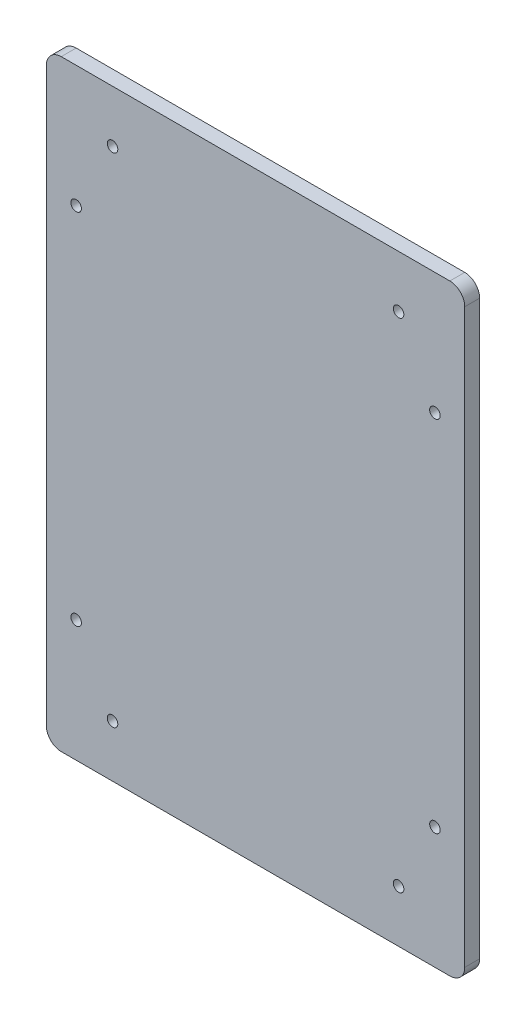
ISO-10303-21;
HEADER;
FILE_DESCRIPTION(('STEP AP214'),'2;1');
FILE_NAME('part.step','',(''),(''),'','','');
FILE_SCHEMA(('AUTOMOTIVE_DESIGN { 1 0 10303 214 1 1 1 1 }'));
ENDSEC;
DATA;
#1=APPLICATION_CONTEXT('core data for automotive mechanical design processes');
#2=APPLICATION_PROTOCOL_DEFINITION('international standard','automotive_design',2000,#1);
#3=PRODUCT_CONTEXT('',#1,'mechanical');
#4=PRODUCT('Part','Part','',(#3));
#5=PRODUCT_RELATED_PRODUCT_CATEGORY('part','',(#4));
#6=PRODUCT_DEFINITION_FORMATION('','',#4);
#7=PRODUCT_DEFINITION_CONTEXT('part definition',#1,'design');
#8=PRODUCT_DEFINITION('design','',#6,#7);
#9=PRODUCT_DEFINITION_SHAPE('','',#8);
#10=(LENGTH_UNIT() NAMED_UNIT(*) SI_UNIT(.MILLI.,.METRE.));
#11=(NAMED_UNIT(*) PLANE_ANGLE_UNIT() SI_UNIT($,.RADIAN.));
#12=(NAMED_UNIT(*) SI_UNIT($,.STERADIAN.) SOLID_ANGLE_UNIT());
#13=UNCERTAINTY_MEASURE_WITH_UNIT(LENGTH_MEASURE(1.E-05),#10,'distance_accuracy_value','');
#14=(GEOMETRIC_REPRESENTATION_CONTEXT(3) GLOBAL_UNCERTAINTY_ASSIGNED_CONTEXT((#13)) GLOBAL_UNIT_ASSIGNED_CONTEXT((#10,
#11,#12)) REPRESENTATION_CONTEXT('',''));
#15=CARTESIAN_POINT('',(0.,0.,0.));
#16=DIRECTION('',(0.,0.,1.));
#17=DIRECTION('',(1.,0.,0.));
#18=AXIS2_PLACEMENT_3D('',#15,#16,#17);
#19=CARTESIAN_POINT('',(89.16035,-128.27,6.35));
#20=DIRECTION('',(-1.,0.,0.));
#21=DIRECTION('',(0.,0.,1.));
#22=AXIS2_PLACEMENT_3D('',#19,#20,#21);
#23=PLANE('',#22);
#24=DIRECTION('',(0.,1.,0.));
#25=VECTOR('',#24,1.);
#26=CARTESIAN_POINT('',(89.16035,-128.27,0.));
#27=LINE('',#26,#25);
#28=CARTESIAN_POINT('',(89.16035,-121.92,0.));
#29=VERTEX_POINT('',#28);
#30=CARTESIAN_POINT('',(89.16035,121.92,0.));
#31=VERTEX_POINT('',#30);
#32=EDGE_CURVE('E126',#29,#31,#27,.T.);
#33=ORIENTED_EDGE('',*,*,#32,.T.);
#34=DIRECTION('',(0.,0.,-1.));
#35=VECTOR('',#34,1.);
#36=CARTESIAN_POINT('',(89.16035,121.92,6.35));
#37=LINE('',#36,#35);
#38=CARTESIAN_POINT('',(89.16035,121.92,6.35));
#39=VERTEX_POINT('',#38);
#40=EDGE_CURVE('E104',#31,#39,#37,.F.);
#41=ORIENTED_EDGE('',*,*,#40,.T.);
#42=DIRECTION('',(0.,1.,0.));
#43=VECTOR('',#42,1.);
#44=CARTESIAN_POINT('',(89.16035,-128.27,6.35));
#45=LINE('',#44,#43);
#46=CARTESIAN_POINT('',(89.16035,-121.92,6.35));
#47=VERTEX_POINT('',#46);
#48=EDGE_CURVE('E136',#47,#39,#45,.T.);
#49=ORIENTED_EDGE('',*,*,#48,.F.);
#50=DIRECTION('',(0.,0.,-1.));
#51=VECTOR('',#50,1.);
#52=CARTESIAN_POINT('',(89.16035,-121.92,6.35));
#53=LINE('',#52,#51);
#54=EDGE_CURVE('E109',#47,#29,#53,.T.);
#55=ORIENTED_EDGE('',*,*,#54,.T.);
#56=EDGE_LOOP('',(#33,#41,#49,#55));
#57=FACE_BOUND('',#56,.T.);
#58=ADVANCED_FACE('F33',(#57),#23,.F.);
#59=CARTESIAN_POINT('',(-89.16035,128.27,6.35));
#60=DIRECTION('',(0.,-1.,0.));
#61=DIRECTION('',(0.,0.,-1.));
#62=AXIS2_PLACEMENT_3D('',#59,#60,#61);
#63=PLANE('',#62);
#64=DIRECTION('',(-1.,0.,0.));
#65=VECTOR('',#64,1.);
#66=CARTESIAN_POINT('',(-89.16035,128.27,6.35));
#67=LINE('',#66,#65);
#68=CARTESIAN_POINT('',(82.8103499999999,128.27,6.35));
#69=VERTEX_POINT('',#68);
#70=CARTESIAN_POINT('',(-82.81035,128.27,6.35));
#71=VERTEX_POINT('',#70);
#72=EDGE_CURVE('E119',#69,#71,#67,.T.);
#73=ORIENTED_EDGE('',*,*,#72,.F.);
#74=DIRECTION('',(0.,0.,-1.));
#75=VECTOR('',#74,1.);
#76=CARTESIAN_POINT('',(82.81035,128.27,6.35));
#77=LINE('',#76,#75);
#78=CARTESIAN_POINT('',(82.8103499999999,128.27,0.));
#79=VERTEX_POINT('',#78);
#80=EDGE_CURVE('E103',#69,#79,#77,.T.);
#81=ORIENTED_EDGE('',*,*,#80,.T.);
#82=DIRECTION('',(-1.,0.,0.));
#83=VECTOR('',#82,1.);
#84=CARTESIAN_POINT('',(-89.16035,128.27,0.));
#85=LINE('',#84,#83);
#86=CARTESIAN_POINT('',(-82.81035,128.27,0.));
#87=VERTEX_POINT('',#86);
#88=EDGE_CURVE('E116',#79,#87,#85,.T.);
#89=ORIENTED_EDGE('',*,*,#88,.T.);
#90=DIRECTION('',(0.,0.,-1.));
#91=VECTOR('',#90,1.);
#92=CARTESIAN_POINT('',(-82.81035,128.27,6.35));
#93=LINE('',#92,#91);
#94=EDGE_CURVE('E121',#87,#71,#93,.F.);
#95=ORIENTED_EDGE('',*,*,#94,.T.);
#96=EDGE_LOOP('',(#73,#81,#89,#95));
#97=FACE_BOUND('',#96,.T.);
#98=ADVANCED_FACE('F115',(#97),#63,.F.);
#99=CARTESIAN_POINT('',(-89.16035,-128.27,6.35));
#100=DIRECTION('',(1.,0.,0.));
#101=DIRECTION('',(0.,0.,-1.));
#102=AXIS2_PLACEMENT_3D('',#99,#100,#101);
#103=PLANE('',#102);
#104=DIRECTION('',(0.,-1.,0.));
#105=VECTOR('',#104,1.);
#106=CARTESIAN_POINT('',(-89.16035,-128.27,0.));
#107=LINE('',#106,#105);
#108=CARTESIAN_POINT('',(-89.16035,121.92,0.));
#109=VERTEX_POINT('',#108);
#110=CARTESIAN_POINT('',(-89.16035,-121.92,0.));
#111=VERTEX_POINT('',#110);
#112=EDGE_CURVE('E125',#109,#111,#107,.T.);
#113=ORIENTED_EDGE('',*,*,#112,.T.);
#114=DIRECTION('',(0.,0.,-1.));
#115=VECTOR('',#114,1.);
#116=CARTESIAN_POINT('',(-89.16035,-121.92,6.35));
#117=LINE('',#116,#115);
#118=CARTESIAN_POINT('',(-89.16035,-121.92,6.35));
#119=VERTEX_POINT('',#118);
#120=EDGE_CURVE('E11',#111,#119,#117,.F.);
#121=ORIENTED_EDGE('',*,*,#120,.T.);
#122=DIRECTION('',(0.,-1.,0.));
#123=VECTOR('',#122,1.);
#124=CARTESIAN_POINT('',(-89.16035,-128.27,6.35));
#125=LINE('',#124,#123);
#126=CARTESIAN_POINT('',(-89.16035,121.92,6.35));
#127=VERTEX_POINT('',#126);
#128=EDGE_CURVE('E162',#127,#119,#125,.T.);
#129=ORIENTED_EDGE('',*,*,#128,.F.);
#130=DIRECTION('',(0.,0.,-1.));
#131=VECTOR('',#130,1.);
#132=CARTESIAN_POINT('',(-89.16035,121.92,6.35));
#133=LINE('',#132,#131);
#134=EDGE_CURVE('E41',#127,#109,#133,.T.);
#135=ORIENTED_EDGE('',*,*,#134,.T.);
#136=EDGE_LOOP('',(#113,#121,#129,#135));
#137=FACE_BOUND('',#136,.T.);
#138=ADVANCED_FACE('F160',(#137),#103,.F.);
#139=CARTESIAN_POINT('',(-89.16035,-128.27,6.35));
#140=DIRECTION('',(0.,1.,0.));
#141=DIRECTION('',(0.,0.,1.));
#142=AXIS2_PLACEMENT_3D('',#139,#140,#141);
#143=PLANE('',#142);
#144=DIRECTION('',(1.,0.,0.));
#145=VECTOR('',#144,1.);
#146=CARTESIAN_POINT('',(-89.16035,-128.27,0.));
#147=LINE('',#146,#145);
#148=CARTESIAN_POINT('',(-82.81035,-128.27,0.));
#149=VERTEX_POINT('',#148);
#150=CARTESIAN_POINT('',(82.8103499999999,-128.27,0.));
#151=VERTEX_POINT('',#150);
#152=EDGE_CURVE('E129',#149,#151,#147,.T.);
#153=ORIENTED_EDGE('',*,*,#152,.T.);
#154=DIRECTION('',(0.,0.,-1.));
#155=VECTOR('',#154,1.);
#156=CARTESIAN_POINT('',(82.81035,-128.27,6.35));
#157=LINE('',#156,#155);
#158=CARTESIAN_POINT('',(82.8103499999999,-128.27,6.35));
#159=VERTEX_POINT('',#158);
#160=EDGE_CURVE('E48',#151,#159,#157,.F.);
#161=ORIENTED_EDGE('',*,*,#160,.T.);
#162=DIRECTION('',(1.,0.,0.));
#163=VECTOR('',#162,1.);
#164=CARTESIAN_POINT('',(-89.16035,-128.27,6.35));
#165=LINE('',#164,#163);
#166=CARTESIAN_POINT('',(-82.81035,-128.27,6.35));
#167=VERTEX_POINT('',#166);
#168=EDGE_CURVE('E137',#167,#159,#165,.T.);
#169=ORIENTED_EDGE('',*,*,#168,.F.);
#170=DIRECTION('',(0.,0.,-1.));
#171=VECTOR('',#170,1.);
#172=CARTESIAN_POINT('',(-82.81035,-128.27,6.35));
#173=LINE('',#172,#171);
#174=EDGE_CURVE('E153',#167,#149,#173,.T.);
#175=ORIENTED_EDGE('',*,*,#174,.T.);
#176=EDGE_LOOP('',(#153,#161,#169,#175));
#177=FACE_BOUND('',#176,.T.);
#178=ADVANCED_FACE('F169',(#177),#143,.F.);
#179=CARTESIAN_POINT('',(0.,0.,6.35));
#180=DIRECTION('',(0.,0.,-1.));
#181=DIRECTION('',(-1.,0.,0.));
#182=AXIS2_PLACEMENT_3D('',#179,#180,#181);
#183=PLANE('',#182);
#184=CARTESIAN_POINT('',(60.96,106.045,6.34999999999999));
#185=DIRECTION('',(0.,0.,-1.));
#186=DIRECTION('',(-1.,0.,0.));
#187=AXIS2_PLACEMENT_3D('',#184,#185,#186);
#188=CIRCLE('',#187,2.24789999999999);
#189=CARTESIAN_POINT('',(58.7121,106.045,6.34999999999999));
#190=VERTEX_POINT('',#189);
#191=EDGE_CURVE('E217',#190,#190,#188,.T.);
#192=ORIENTED_EDGE('',*,*,#191,.T.);
#193=EDGE_LOOP('',(#192));
#194=FACE_BOUND('',#193,.T.);
#195=CARTESIAN_POINT('',(-60.96,106.045,6.34999999999999));
#196=DIRECTION('',(0.,0.,-1.));
#197=DIRECTION('',(-1.,0.,0.));
#198=AXIS2_PLACEMENT_3D('',#195,#196,#197);
#199=CIRCLE('',#198,2.24789999999999);
#200=CARTESIAN_POINT('',(-63.2079,106.045,6.34999999999999));
#201=VERTEX_POINT('',#200);
#202=EDGE_CURVE('E211',#201,#201,#199,.T.);
#203=ORIENTED_EDGE('',*,*,#202,.T.);
#204=EDGE_LOOP('',(#203));
#205=FACE_BOUND('',#204,.T.);
#206=CARTESIAN_POINT('',(60.96,-106.045,6.34999999999999));
#207=DIRECTION('',(0.,0.,-1.));
#208=DIRECTION('',(-1.,0.,0.));
#209=AXIS2_PLACEMENT_3D('',#206,#207,#208);
#210=CIRCLE('',#209,2.24789999999999);
#211=CARTESIAN_POINT('',(58.7121,-106.045,6.34999999999999));
#212=VERTEX_POINT('',#211);
#213=EDGE_CURVE('E205',#212,#212,#210,.T.);
#214=ORIENTED_EDGE('',*,*,#213,.T.);
#215=EDGE_LOOP('',(#214));
#216=FACE_BOUND('',#215,.T.);
#217=CARTESIAN_POINT('',(-60.96,-106.045,6.34999999999999));
#218=DIRECTION('',(0.,0.,-1.));
#219=DIRECTION('',(-1.,0.,0.));
#220=AXIS2_PLACEMENT_3D('',#217,#218,#219);
#221=CIRCLE('',#220,2.24789999999999);
#222=CARTESIAN_POINT('',(-63.2079,-106.045,6.34999999999999));
#223=VERTEX_POINT('',#222);
#224=EDGE_CURVE('E199',#223,#223,#221,.T.);
#225=ORIENTED_EDGE('',*,*,#224,.T.);
#226=EDGE_LOOP('',(#225));
#227=FACE_BOUND('',#226,.T.);
#228=CARTESIAN_POINT('',(76.46035,-76.46035,6.34999999999999));
#229=DIRECTION('',(0.,0.,-1.));
#230=DIRECTION('',(-1.,0.,0.));
#231=AXIS2_PLACEMENT_3D('',#228,#229,#230);
#232=CIRCLE('',#231,2.24789999999998);
#233=CARTESIAN_POINT('',(74.21245,-76.46035,6.34999999999999));
#234=VERTEX_POINT('',#233);
#235=EDGE_CURVE('E193',#234,#234,#232,.T.);
#236=ORIENTED_EDGE('',*,*,#235,.T.);
#237=EDGE_LOOP('',(#236));
#238=FACE_BOUND('',#237,.T.);
#239=CARTESIAN_POINT('',(76.46035,76.46035,6.34999999999999));
#240=DIRECTION('',(0.,0.,-1.));
#241=DIRECTION('',(-1.,0.,0.));
#242=AXIS2_PLACEMENT_3D('',#239,#240,#241);
#243=CIRCLE('',#242,2.24789999999998);
#244=CARTESIAN_POINT('',(74.21245,76.46035,6.34999999999999));
#245=VERTEX_POINT('',#244);
#246=EDGE_CURVE('E187',#245,#245,#243,.T.);
#247=ORIENTED_EDGE('',*,*,#246,.T.);
#248=EDGE_LOOP('',(#247));
#249=FACE_BOUND('',#248,.T.);
#250=CARTESIAN_POINT('',(-76.46035,76.46035,6.34999999999999));
#251=DIRECTION('',(0.,0.,-1.));
#252=DIRECTION('',(-1.,0.,0.));
#253=AXIS2_PLACEMENT_3D('',#250,#251,#252);
#254=CIRCLE('',#253,2.24789999999998);
#255=CARTESIAN_POINT('',(-78.7082499999999,76.46035,6.34999999999999));
#256=VERTEX_POINT('',#255);
#257=EDGE_CURVE('E181',#256,#256,#254,.T.);
#258=ORIENTED_EDGE('',*,*,#257,.T.);
#259=EDGE_LOOP('',(#258));
#260=FACE_BOUND('',#259,.T.);
#261=CARTESIAN_POINT('',(-76.46035,-76.46035,6.34999999999999));
#262=DIRECTION('',(0.,0.,-1.));
#263=DIRECTION('',(-1.,0.,0.));
#264=AXIS2_PLACEMENT_3D('',#261,#262,#263);
#265=CIRCLE('',#264,2.24789999999998);
#266=CARTESIAN_POINT('',(-78.7082499999999,-76.46035,6.34999999999999));
#267=VERTEX_POINT('',#266);
#268=EDGE_CURVE('E131',#267,#267,#265,.T.);
#269=ORIENTED_EDGE('',*,*,#268,.T.);
#270=EDGE_LOOP('',(#269));
#271=FACE_BOUND('',#270,.T.);
#272=ORIENTED_EDGE('',*,*,#48,.T.);
#273=CARTESIAN_POINT('',(82.81035,121.92,6.35));
#274=DIRECTION('',(0.,0.,-1.));
#275=DIRECTION('',(-1.,0.,0.));
#276=AXIS2_PLACEMENT_3D('',#273,#274,#275);
#277=CIRCLE('',#276,6.35);
#278=EDGE_CURVE('E151',#39,#69,#277,.F.);
#279=ORIENTED_EDGE('',*,*,#278,.T.);
#280=ORIENTED_EDGE('',*,*,#72,.T.);
#281=CARTESIAN_POINT('',(-82.81035,121.92,6.35));
#282=DIRECTION('',(0.,0.,-1.));
#283=DIRECTION('',(-1.,0.,0.));
#284=AXIS2_PLACEMENT_3D('',#281,#282,#283);
#285=CIRCLE('',#284,6.35);
#286=EDGE_CURVE('E146',#71,#127,#285,.F.);
#287=ORIENTED_EDGE('',*,*,#286,.T.);
#288=ORIENTED_EDGE('',*,*,#128,.T.);
#289=CARTESIAN_POINT('',(-82.81035,-121.92,6.35));
#290=DIRECTION('',(0.,0.,-1.));
#291=DIRECTION('',(-1.,0.,0.));
#292=AXIS2_PLACEMENT_3D('',#289,#290,#291);
#293=CIRCLE('',#292,6.35);
#294=EDGE_CURVE('E55',#119,#167,#293,.F.);
#295=ORIENTED_EDGE('',*,*,#294,.T.);
#296=ORIENTED_EDGE('',*,*,#168,.T.);
#297=CARTESIAN_POINT('',(82.81035,-121.92,6.35));
#298=DIRECTION('',(0.,0.,-1.));
#299=DIRECTION('',(-1.,0.,0.));
#300=AXIS2_PLACEMENT_3D('',#297,#298,#299);
#301=CIRCLE('',#300,6.35);
#302=EDGE_CURVE('E149',#159,#47,#301,.F.);
#303=ORIENTED_EDGE('',*,*,#302,.T.);
#304=EDGE_LOOP('',(#272,#279,#280,#287,#288,#295,#296,#303));
#305=FACE_BOUND('',#304,.T.);
#306=ADVANCED_FACE('F228',(#194,#205,#216,#227,#238,#249,#260,#271,#305),#183,.F.);
#307=CARTESIAN_POINT('',(0.,0.,0.));
#308=DIRECTION('',(0.,0.,-1.));
#309=DIRECTION('',(-1.,0.,0.));
#310=AXIS2_PLACEMENT_3D('',#307,#308,#309);
#311=PLANE('',#310);
#312=CARTESIAN_POINT('',(60.96,106.045,0.));
#313=DIRECTION('',(0.,0.,-1.));
#314=DIRECTION('',(-1.,0.,0.));
#315=AXIS2_PLACEMENT_3D('',#312,#313,#314);
#316=CIRCLE('',#315,2.24789999999999);
#317=CARTESIAN_POINT('',(58.7121,106.045,0.));
#318=VERTEX_POINT('',#317);
#319=EDGE_CURVE('E220',#318,#318,#316,.T.);
#320=ORIENTED_EDGE('',*,*,#319,.F.);
#321=EDGE_LOOP('',(#320));
#322=FACE_BOUND('',#321,.T.);
#323=CARTESIAN_POINT('',(-60.96,106.045,0.));
#324=DIRECTION('',(0.,0.,-1.));
#325=DIRECTION('',(-1.,0.,0.));
#326=AXIS2_PLACEMENT_3D('',#323,#324,#325);
#327=CIRCLE('',#326,2.24789999999999);
#328=CARTESIAN_POINT('',(-63.2079,106.045,0.));
#329=VERTEX_POINT('',#328);
#330=EDGE_CURVE('E214',#329,#329,#327,.T.);
#331=ORIENTED_EDGE('',*,*,#330,.F.);
#332=EDGE_LOOP('',(#331));
#333=FACE_BOUND('',#332,.T.);
#334=CARTESIAN_POINT('',(60.96,-106.045,0.));
#335=DIRECTION('',(0.,0.,-1.));
#336=DIRECTION('',(-1.,0.,0.));
#337=AXIS2_PLACEMENT_3D('',#334,#335,#336);
#338=CIRCLE('',#337,2.24789999999999);
#339=CARTESIAN_POINT('',(58.7121,-106.045,0.));
#340=VERTEX_POINT('',#339);
#341=EDGE_CURVE('E208',#340,#340,#338,.T.);
#342=ORIENTED_EDGE('',*,*,#341,.F.);
#343=EDGE_LOOP('',(#342));
#344=FACE_BOUND('',#343,.T.);
#345=CARTESIAN_POINT('',(-60.96,-106.045,0.));
#346=DIRECTION('',(0.,0.,-1.));
#347=DIRECTION('',(-1.,0.,0.));
#348=AXIS2_PLACEMENT_3D('',#345,#346,#347);
#349=CIRCLE('',#348,2.24789999999999);
#350=CARTESIAN_POINT('',(-63.2079,-106.045,0.));
#351=VERTEX_POINT('',#350);
#352=EDGE_CURVE('E202',#351,#351,#349,.T.);
#353=ORIENTED_EDGE('',*,*,#352,.F.);
#354=EDGE_LOOP('',(#353));
#355=FACE_BOUND('',#354,.T.);
#356=CARTESIAN_POINT('',(76.46035,-76.46035,0.));
#357=DIRECTION('',(0.,0.,-1.));
#358=DIRECTION('',(-1.,0.,0.));
#359=AXIS2_PLACEMENT_3D('',#356,#357,#358);
#360=CIRCLE('',#359,2.24789999999998);
#361=CARTESIAN_POINT('',(74.21245,-76.46035,0.));
#362=VERTEX_POINT('',#361);
#363=EDGE_CURVE('E196',#362,#362,#360,.T.);
#364=ORIENTED_EDGE('',*,*,#363,.F.);
#365=EDGE_LOOP('',(#364));
#366=FACE_BOUND('',#365,.T.);
#367=CARTESIAN_POINT('',(76.46035,76.46035,0.));
#368=DIRECTION('',(0.,0.,-1.));
#369=DIRECTION('',(-1.,0.,0.));
#370=AXIS2_PLACEMENT_3D('',#367,#368,#369);
#371=CIRCLE('',#370,2.24789999999998);
#372=CARTESIAN_POINT('',(74.21245,76.46035,0.));
#373=VERTEX_POINT('',#372);
#374=EDGE_CURVE('E190',#373,#373,#371,.T.);
#375=ORIENTED_EDGE('',*,*,#374,.F.);
#376=EDGE_LOOP('',(#375));
#377=FACE_BOUND('',#376,.T.);
#378=CARTESIAN_POINT('',(-76.46035,76.46035,0.));
#379=DIRECTION('',(0.,0.,-1.));
#380=DIRECTION('',(-1.,0.,0.));
#381=AXIS2_PLACEMENT_3D('',#378,#379,#380);
#382=CIRCLE('',#381,2.24789999999998);
#383=CARTESIAN_POINT('',(-78.7082499999999,76.46035,0.));
#384=VERTEX_POINT('',#383);
#385=EDGE_CURVE('E184',#384,#384,#382,.T.);
#386=ORIENTED_EDGE('',*,*,#385,.F.);
#387=EDGE_LOOP('',(#386));
#388=FACE_BOUND('',#387,.T.);
#389=CARTESIAN_POINT('',(-76.46035,-76.46035,0.));
#390=DIRECTION('',(0.,0.,-1.));
#391=DIRECTION('',(-1.,0.,0.));
#392=AXIS2_PLACEMENT_3D('',#389,#390,#391);
#393=CIRCLE('',#392,2.24789999999998);
#394=CARTESIAN_POINT('',(-78.7082499999999,-76.46035,0.));
#395=VERTEX_POINT('',#394);
#396=EDGE_CURVE('E178',#395,#395,#393,.T.);
#397=ORIENTED_EDGE('',*,*,#396,.F.);
#398=EDGE_LOOP('',(#397));
#399=FACE_BOUND('',#398,.T.);
#400=ORIENTED_EDGE('',*,*,#88,.F.);
#401=CARTESIAN_POINT('',(82.81035,121.92,0.));
#402=DIRECTION('',(0.,0.,-1.));
#403=DIRECTION('',(-1.,0.,0.));
#404=AXIS2_PLACEMENT_3D('',#401,#402,#403);
#405=CIRCLE('',#404,6.35);
#406=EDGE_CURVE('E99',#79,#31,#405,.T.);
#407=ORIENTED_EDGE('',*,*,#406,.T.);
#408=ORIENTED_EDGE('',*,*,#32,.F.);
#409=CARTESIAN_POINT('',(82.81035,-121.92,0.));
#410=DIRECTION('',(0.,0.,-1.));
#411=DIRECTION('',(-1.,0.,0.));
#412=AXIS2_PLACEMENT_3D('',#409,#410,#411);
#413=CIRCLE('',#412,6.35);
#414=EDGE_CURVE('E110',#29,#151,#413,.T.);
#415=ORIENTED_EDGE('',*,*,#414,.T.);
#416=ORIENTED_EDGE('',*,*,#152,.F.);
#417=CARTESIAN_POINT('',(-82.81035,-121.92,0.));
#418=DIRECTION('',(0.,0.,-1.));
#419=DIRECTION('',(-1.,0.,0.));
#420=AXIS2_PLACEMENT_3D('',#417,#418,#419);
#421=CIRCLE('',#420,6.35);
#422=EDGE_CURVE('E140',#149,#111,#421,.T.);
#423=ORIENTED_EDGE('',*,*,#422,.T.);
#424=ORIENTED_EDGE('',*,*,#112,.F.);
#425=CARTESIAN_POINT('',(-82.81035,121.92,0.));
#426=DIRECTION('',(0.,0.,-1.));
#427=DIRECTION('',(-1.,0.,0.));
#428=AXIS2_PLACEMENT_3D('',#425,#426,#427);
#429=CIRCLE('',#428,6.35);
#430=EDGE_CURVE('E120',#109,#87,#429,.T.);
#431=ORIENTED_EDGE('',*,*,#430,.T.);
#432=EDGE_LOOP('',(#400,#407,#408,#415,#416,#423,#424,#431));
#433=FACE_BOUND('',#432,.T.);
#434=ADVANCED_FACE('F123',(#322,#333,#344,#355,#366,#377,#388,#399,#433),#311,.T.);
#435=CARTESIAN_POINT('',(82.81035,121.92,6.35));
#436=DIRECTION('',(0.,0.,-1.));
#437=DIRECTION('',(-1.,0.,0.));
#438=AXIS2_PLACEMENT_3D('',#435,#436,#437);
#439=CYLINDRICAL_SURFACE('',#438,6.35);
#440=ORIENTED_EDGE('',*,*,#278,.F.);
#441=ORIENTED_EDGE('',*,*,#40,.F.);
#442=ORIENTED_EDGE('',*,*,#406,.F.);
#443=ORIENTED_EDGE('',*,*,#80,.F.);
#444=EDGE_LOOP('',(#440,#441,#442,#443));
#445=FACE_BOUND('',#444,.T.);
#446=ADVANCED_FACE('F102',(#445),#439,.T.);
#447=CARTESIAN_POINT('',(82.81035,-121.92,6.35));
#448=DIRECTION('',(0.,0.,-1.));
#449=DIRECTION('',(-1.,0.,0.));
#450=AXIS2_PLACEMENT_3D('',#447,#448,#449);
#451=CYLINDRICAL_SURFACE('',#450,6.35);
#452=ORIENTED_EDGE('',*,*,#302,.F.);
#453=ORIENTED_EDGE('',*,*,#160,.F.);
#454=ORIENTED_EDGE('',*,*,#414,.F.);
#455=ORIENTED_EDGE('',*,*,#54,.F.);
#456=EDGE_LOOP('',(#452,#453,#454,#455));
#457=FACE_BOUND('',#456,.T.);
#458=ADVANCED_FACE('F269',(#457),#451,.T.);
#459=CARTESIAN_POINT('',(-82.81035,-121.92,6.35));
#460=DIRECTION('',(0.,0.,-1.));
#461=DIRECTION('',(-1.,0.,0.));
#462=AXIS2_PLACEMENT_3D('',#459,#460,#461);
#463=CYLINDRICAL_SURFACE('',#462,6.35);
#464=ORIENTED_EDGE('',*,*,#294,.F.);
#465=ORIENTED_EDGE('',*,*,#120,.F.);
#466=ORIENTED_EDGE('',*,*,#422,.F.);
#467=ORIENTED_EDGE('',*,*,#174,.F.);
#468=EDGE_LOOP('',(#464,#465,#466,#467));
#469=FACE_BOUND('',#468,.T.);
#470=ADVANCED_FACE('F168',(#469),#463,.T.);
#471=CARTESIAN_POINT('',(-82.81035,121.92,6.35));
#472=DIRECTION('',(0.,0.,-1.));
#473=DIRECTION('',(-1.,0.,0.));
#474=AXIS2_PLACEMENT_3D('',#471,#472,#473);
#475=CYLINDRICAL_SURFACE('',#474,6.35);
#476=ORIENTED_EDGE('',*,*,#286,.F.);
#477=ORIENTED_EDGE('',*,*,#94,.F.);
#478=ORIENTED_EDGE('',*,*,#430,.F.);
#479=ORIENTED_EDGE('',*,*,#134,.F.);
#480=EDGE_LOOP('',(#476,#477,#478,#479));
#481=FACE_BOUND('',#480,.T.);
#482=ADVANCED_FACE('F35',(#481),#475,.T.);
#483=CARTESIAN_POINT('',(-76.46035,-76.46035,0.));
#484=DIRECTION('',(0.,0.,-1.));
#485=DIRECTION('',(-1.,0.,0.));
#486=AXIS2_PLACEMENT_3D('',#483,#484,#485);
#487=CYLINDRICAL_SURFACE('',#486,2.24789999999998);
#488=ORIENTED_EDGE('',*,*,#268,.F.);
#489=EDGE_LOOP('',(#488));
#490=FACE_BOUND('',#489,.T.);
#491=ORIENTED_EDGE('',*,*,#396,.T.);
#492=EDGE_LOOP('',(#491));
#493=FACE_BOUND('',#492,.T.);
#494=ADVANCED_FACE('F244',(#490,#493),#487,.F.);
#495=CARTESIAN_POINT('',(-76.46035,76.46035,0.));
#496=DIRECTION('',(0.,0.,-1.));
#497=DIRECTION('',(-1.,0.,0.));
#498=AXIS2_PLACEMENT_3D('',#495,#496,#497);
#499=CYLINDRICAL_SURFACE('',#498,2.24789999999998);
#500=ORIENTED_EDGE('',*,*,#257,.F.);
#501=EDGE_LOOP('',(#500));
#502=FACE_BOUND('',#501,.T.);
#503=ORIENTED_EDGE('',*,*,#385,.T.);
#504=EDGE_LOOP('',(#503));
#505=FACE_BOUND('',#504,.T.);
#506=ADVANCED_FACE('F246',(#502,#505),#499,.F.);
#507=CARTESIAN_POINT('',(76.46035,76.46035,0.));
#508=DIRECTION('',(0.,0.,-1.));
#509=DIRECTION('',(-1.,0.,0.));
#510=AXIS2_PLACEMENT_3D('',#507,#508,#509);
#511=CYLINDRICAL_SURFACE('',#510,2.24789999999998);
#512=ORIENTED_EDGE('',*,*,#246,.F.);
#513=EDGE_LOOP('',(#512));
#514=FACE_BOUND('',#513,.T.);
#515=ORIENTED_EDGE('',*,*,#374,.T.);
#516=EDGE_LOOP('',(#515));
#517=FACE_BOUND('',#516,.T.);
#518=ADVANCED_FACE('F253',(#514,#517),#511,.F.);
#519=CARTESIAN_POINT('',(76.46035,-76.46035,0.));
#520=DIRECTION('',(0.,0.,-1.));
#521=DIRECTION('',(-1.,0.,0.));
#522=AXIS2_PLACEMENT_3D('',#519,#520,#521);
#523=CYLINDRICAL_SURFACE('',#522,2.24789999999998);
#524=ORIENTED_EDGE('',*,*,#235,.F.);
#525=EDGE_LOOP('',(#524));
#526=FACE_BOUND('',#525,.T.);
#527=ORIENTED_EDGE('',*,*,#363,.T.);
#528=EDGE_LOOP('',(#527));
#529=FACE_BOUND('',#528,.T.);
#530=ADVANCED_FACE('F317',(#526,#529),#523,.F.);
#531=CARTESIAN_POINT('',(-60.96,-106.045,0.));
#532=DIRECTION('',(0.,0.,-1.));
#533=DIRECTION('',(-1.,0.,0.));
#534=AXIS2_PLACEMENT_3D('',#531,#532,#533);
#535=CYLINDRICAL_SURFACE('',#534,2.24789999999999);
#536=ORIENTED_EDGE('',*,*,#224,.F.);
#537=EDGE_LOOP('',(#536));
#538=FACE_BOUND('',#537,.T.);
#539=ORIENTED_EDGE('',*,*,#352,.T.);
#540=EDGE_LOOP('',(#539));
#541=FACE_BOUND('',#540,.T.);
#542=ADVANCED_FACE('F327',(#538,#541),#535,.F.);
#543=CARTESIAN_POINT('',(60.96,-106.045,0.));
#544=DIRECTION('',(0.,0.,-1.));
#545=DIRECTION('',(-1.,0.,0.));
#546=AXIS2_PLACEMENT_3D('',#543,#544,#545);
#547=CYLINDRICAL_SURFACE('',#546,2.24789999999999);
#548=ORIENTED_EDGE('',*,*,#213,.F.);
#549=EDGE_LOOP('',(#548));
#550=FACE_BOUND('',#549,.T.);
#551=ORIENTED_EDGE('',*,*,#341,.T.);
#552=EDGE_LOOP('',(#551));
#553=FACE_BOUND('',#552,.T.);
#554=ADVANCED_FACE('F337',(#550,#553),#547,.F.);
#555=CARTESIAN_POINT('',(-60.96,106.045,0.));
#556=DIRECTION('',(0.,0.,-1.));
#557=DIRECTION('',(-1.,0.,0.));
#558=AXIS2_PLACEMENT_3D('',#555,#556,#557);
#559=CYLINDRICAL_SURFACE('',#558,2.24789999999999);
#560=ORIENTED_EDGE('',*,*,#202,.F.);
#561=EDGE_LOOP('',(#560));
#562=FACE_BOUND('',#561,.T.);
#563=ORIENTED_EDGE('',*,*,#330,.T.);
#564=EDGE_LOOP('',(#563));
#565=FACE_BOUND('',#564,.T.);
#566=ADVANCED_FACE('F347',(#562,#565),#559,.F.);
#567=CARTESIAN_POINT('',(60.96,106.045,0.));
#568=DIRECTION('',(0.,0.,-1.));
#569=DIRECTION('',(-1.,0.,0.));
#570=AXIS2_PLACEMENT_3D('',#567,#568,#569);
#571=CYLINDRICAL_SURFACE('',#570,2.24789999999999);
#572=ORIENTED_EDGE('',*,*,#191,.F.);
#573=EDGE_LOOP('',(#572));
#574=FACE_BOUND('',#573,.T.);
#575=ORIENTED_EDGE('',*,*,#319,.T.);
#576=EDGE_LOOP('',(#575));
#577=FACE_BOUND('',#576,.T.);
#578=ADVANCED_FACE('F224',(#574,#577),#571,.F.);
#579=CLOSED_SHELL('',(#58,#98,#138,#178,#306,#434,#446,#458,#470,#482,#494,#506,#518,#530,#542,
#554,#566,#578));
#580=MANIFOLD_SOLID_BREP('B2',#579);
#581=ADVANCED_BREP_SHAPE_REPRESENTATION('',(#18,#580),#14);
#582=SHAPE_DEFINITION_REPRESENTATION(#9,#581);
ENDSEC;
END-ISO-10303-21;
